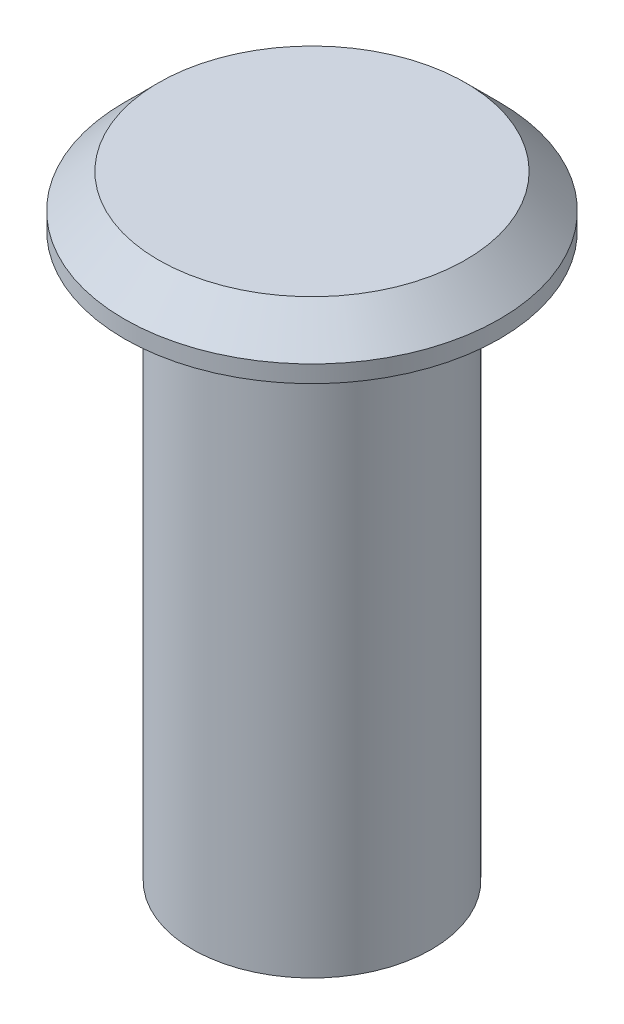
ISO-10303-21;
HEADER;
FILE_DESCRIPTION(('STEP AP214'),'2;1');
FILE_NAME('part.step','',(''),(''),'','','');
FILE_SCHEMA(('AUTOMOTIVE_DESIGN { 1 0 10303 214 1 1 1 1 }'));
ENDSEC;
DATA;
#1=APPLICATION_CONTEXT('core data for automotive mechanical design processes');
#2=APPLICATION_PROTOCOL_DEFINITION('international standard','automotive_design',2000,#1);
#3=PRODUCT_CONTEXT('',#1,'mechanical');
#4=PRODUCT('Part','Part','',(#3));
#5=PRODUCT_RELATED_PRODUCT_CATEGORY('part','',(#4));
#6=PRODUCT_DEFINITION_FORMATION('','',#4);
#7=PRODUCT_DEFINITION_CONTEXT('part definition',#1,'design');
#8=PRODUCT_DEFINITION('design','',#6,#7);
#9=PRODUCT_DEFINITION_SHAPE('','',#8);
#10=(LENGTH_UNIT() NAMED_UNIT(*) SI_UNIT(.MILLI.,.METRE.));
#11=(NAMED_UNIT(*) PLANE_ANGLE_UNIT() SI_UNIT($,.RADIAN.));
#12=(NAMED_UNIT(*) SI_UNIT($,.STERADIAN.) SOLID_ANGLE_UNIT());
#13=UNCERTAINTY_MEASURE_WITH_UNIT(LENGTH_MEASURE(1.E-05),#10,'distance_accuracy_value','');
#14=(GEOMETRIC_REPRESENTATION_CONTEXT(3) GLOBAL_UNCERTAINTY_ASSIGNED_CONTEXT((#13)) GLOBAL_UNIT_ASSIGNED_CONTEXT((#10,
#11,#12)) REPRESENTATION_CONTEXT('',''));
#15=CARTESIAN_POINT('',(0.,0.,0.));
#16=DIRECTION('',(0.,0.,1.));
#17=DIRECTION('',(1.,0.,0.));
#18=AXIS2_PLACEMENT_3D('',#15,#16,#17);
#19=CARTESIAN_POINT('',(0.,18.,0.));
#20=DIRECTION('',(0.,-1.,0.));
#21=DIRECTION('',(0.,0.,-1.));
#22=AXIS2_PLACEMENT_3D('',#19,#20,#21);
#23=PLANE('',#22);
#24=CARTESIAN_POINT('',(0.,18.,0.));
#25=DIRECTION('',(0.,1.,0.));
#26=DIRECTION('',(1.,0.,0.));
#27=AXIS2_PLACEMENT_3D('',#24,#25,#26);
#28=CIRCLE('',#27,4.5);
#29=CARTESIAN_POINT('',(0.,17.9999999999995,4.4999999999995));
#30=VERTEX_POINT('',#29);
#31=EDGE_CURVE('E11',#30,#30,#28,.T.);
#32=ORIENTED_EDGE('',*,*,#31,.T.);
#33=EDGE_LOOP('',(#32));
#34=FACE_BOUND('',#33,.T.);
#35=ADVANCED_FACE('F17',(#34),#23,.F.);
#36=CARTESIAN_POINT('',(0.,17.50000000001,0.));
#37=DIRECTION('',(0.,-1.,0.));
#38=DIRECTION('',(0.,0.,-1.));
#39=AXIS2_PLACEMENT_3D('',#36,#37,#38);
#40=CONICAL_SURFACE('',#39,4.999999999989,0.785398163397448);
#41=CARTESIAN_POINT('',(0.,17.,0.));
#42=DIRECTION('',(0.,1.,0.));
#43=DIRECTION('',(1.,0.,0.));
#44=AXIS2_PLACEMENT_3D('',#41,#42,#43);
#45=CIRCLE('',#44,5.5);
#46=CARTESIAN_POINT('',(5.5,17.,0.));
#47=VERTEX_POINT('',#46);
#48=CARTESIAN_POINT('',(0.,16.9999999999995,5.4999999999995));
#49=VERTEX_POINT('',#48);
#50=EDGE_CURVE('E59',#47,#49,#45,.T.);
#51=ORIENTED_EDGE('',*,*,#50,.T.);
#52=DIRECTION('',(0.,0.707106781186548,-0.707106781186548));
#53=VECTOR('',#52,1.);
#54=CARTESIAN_POINT('',(0.,17.50000000001,4.999999999989));
#55=LINE('',#54,#53);
#56=EDGE_CURVE('E27',#49,#30,#55,.T.);
#57=ORIENTED_EDGE('',*,*,#56,.T.);
#58=ORIENTED_EDGE('',*,*,#31,.F.);
#59=ORIENTED_EDGE('',*,*,#56,.F.);
#60=CARTESIAN_POINT('',(0.,17.,0.));
#61=DIRECTION('',(0.,1.,0.));
#62=DIRECTION('',(1.,0.,0.));
#63=AXIS2_PLACEMENT_3D('',#60,#61,#62);
#64=CIRCLE('',#63,5.5);
#65=EDGE_CURVE('E20',#49,#47,#64,.T.);
#66=ORIENTED_EDGE('',*,*,#65,.T.);
#67=EDGE_LOOP('',(#51,#57,#58,#59,#66));
#68=FACE_BOUND('',#67,.T.);
#69=ADVANCED_FACE('F66',(#68),#40,.T.);
#70=CARTESIAN_POINT('',(0.,18.9,0.));
#71=DIRECTION('',(0.,-1.,0.));
#72=DIRECTION('',(-1.,0.,0.));
#73=AXIS2_PLACEMENT_3D('',#70,#71,#72);
#74=CYLINDRICAL_SURFACE('',#73,5.5);
#75=CARTESIAN_POINT('',(0.,16.5,0.));
#76=DIRECTION('',(0.,1.,0.));
#77=DIRECTION('',(1.,0.,0.));
#78=AXIS2_PLACEMENT_3D('',#75,#76,#77);
#79=CIRCLE('',#78,5.5);
#80=CARTESIAN_POINT('',(5.5,16.5,0.));
#81=VERTEX_POINT('',#80);
#82=EDGE_CURVE('E69',#81,#81,#79,.T.);
#83=ORIENTED_EDGE('',*,*,#82,.T.);
#84=DIRECTION('',(0.,1.,0.));
#85=VECTOR('',#84,1.);
#86=CARTESIAN_POINT('',(5.5,18.9,0.));
#87=LINE('',#86,#85);
#88=EDGE_CURVE('E55',#81,#47,#87,.T.);
#89=ORIENTED_EDGE('',*,*,#88,.T.);
#90=ORIENTED_EDGE('',*,*,#65,.F.);
#91=ORIENTED_EDGE('',*,*,#50,.F.);
#92=ORIENTED_EDGE('',*,*,#88,.F.);
#93=EDGE_LOOP('',(#83,#89,#90,#91,#92));
#94=FACE_BOUND('',#93,.T.);
#95=ADVANCED_FACE('F61',(#94),#74,.T.);
#96=CARTESIAN_POINT('',(0.,16.5,0.));
#97=DIRECTION('',(0.,-1.,0.));
#98=DIRECTION('',(0.,0.,-1.));
#99=AXIS2_PLACEMENT_3D('',#96,#97,#98);
#100=PLANE('',#99);
#101=CARTESIAN_POINT('',(0.,16.5,0.));
#102=DIRECTION('',(0.,-1.,0.));
#103=DIRECTION('',(1.,0.,0.));
#104=AXIS2_PLACEMENT_3D('',#101,#102,#103);
#105=CIRCLE('',#104,3.5);
#106=CARTESIAN_POINT('',(3.5,16.5,0.));
#107=VERTEX_POINT('',#106);
#108=EDGE_CURVE('E76',#107,#107,#105,.T.);
#109=ORIENTED_EDGE('',*,*,#108,.F.);
#110=EDGE_LOOP('',(#109));
#111=FACE_BOUND('',#110,.T.);
#112=ORIENTED_EDGE('',*,*,#82,.F.);
#113=EDGE_LOOP('',(#112));
#114=FACE_BOUND('',#113,.T.);
#115=ADVANCED_FACE('F146',(#111,#114),#100,.T.);
#116=CARTESIAN_POINT('',(0.,18.9,0.));
#117=DIRECTION('',(0.,-1.,0.));
#118=DIRECTION('',(-1.,0.,0.));
#119=AXIS2_PLACEMENT_3D('',#116,#117,#118);
#120=CYLINDRICAL_SURFACE('',#119,3.5);
#121=CARTESIAN_POINT('',(0.,0.,0.));
#122=DIRECTION('',(0.,1.,0.));
#123=DIRECTION('',(1.,0.,0.));
#124=AXIS2_PLACEMENT_3D('',#121,#122,#123);
#125=CIRCLE('',#124,3.5);
#126=CARTESIAN_POINT('',(3.5,0.,0.));
#127=VERTEX_POINT('',#126);
#128=EDGE_CURVE('E80',#127,#127,#125,.T.);
#129=ORIENTED_EDGE('',*,*,#128,.T.);
#130=DIRECTION('',(0.,1.,0.));
#131=VECTOR('',#130,1.);
#132=CARTESIAN_POINT('',(3.5,18.9,0.));
#133=LINE('',#132,#131);
#134=EDGE_CURVE('E83',#127,#107,#133,.T.);
#135=ORIENTED_EDGE('',*,*,#134,.T.);
#136=ORIENTED_EDGE('',*,*,#108,.T.);
#137=ORIENTED_EDGE('',*,*,#134,.F.);
#138=EDGE_LOOP('',(#129,#135,#136,#137));
#139=FACE_BOUND('',#138,.T.);
#140=ADVANCED_FACE('F95',(#139),#120,.T.);
#141=CARTESIAN_POINT('',(0.,0.,0.));
#142=DIRECTION('',(0.,-1.,0.));
#143=DIRECTION('',(0.,0.,-1.));
#144=AXIS2_PLACEMENT_3D('',#141,#142,#143);
#145=PLANE('',#144);
#146=ORIENTED_EDGE('',*,*,#128,.F.);
#147=EDGE_LOOP('',(#146));
#148=FACE_BOUND('',#147,.T.);
#149=ADVANCED_FACE('F139',(#148),#145,.T.);
#150=CLOSED_SHELL('',(#35,#69,#95,#115,#140,#149));
#151=MANIFOLD_SOLID_BREP('B1',#150);
#152=ADVANCED_BREP_SHAPE_REPRESENTATION('',(#18,#151),#14);
#153=SHAPE_DEFINITION_REPRESENTATION(#9,#152);
ENDSEC;
END-ISO-10303-21;
